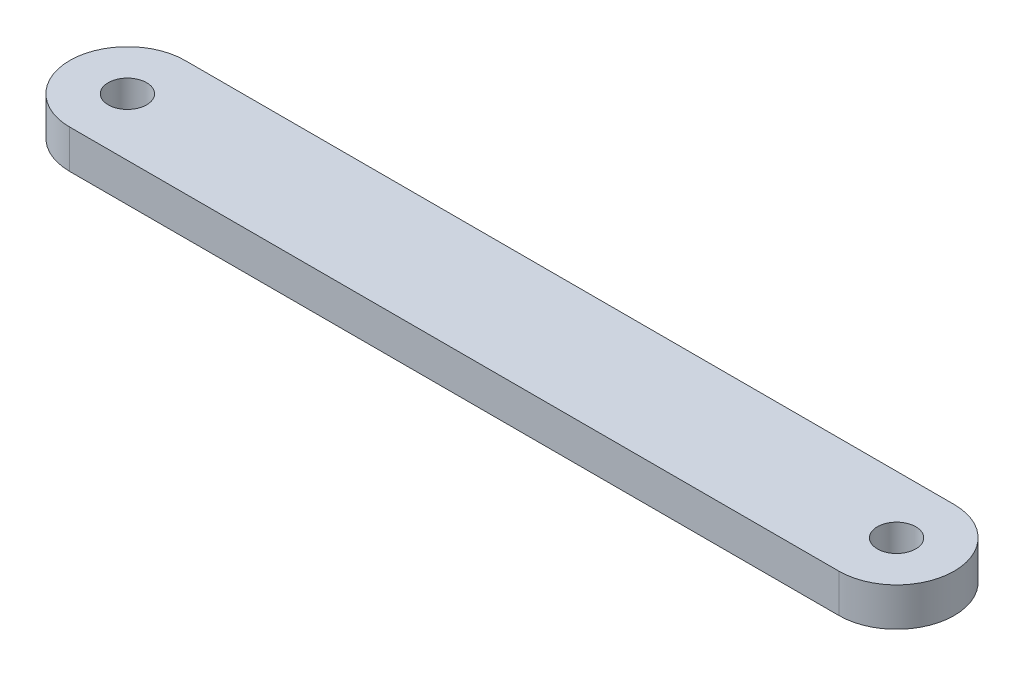
ISO-10303-21;
HEADER;
FILE_DESCRIPTION(('STEP AP214'),'2;1');
FILE_NAME('part.step','',(''),(''),'','','');
FILE_SCHEMA(('AUTOMOTIVE_DESIGN { 1 0 10303 214 1 1 1 1 }'));
ENDSEC;
DATA;
#1=APPLICATION_CONTEXT('core data for automotive mechanical design processes');
#2=APPLICATION_PROTOCOL_DEFINITION('international standard','automotive_design',2000,#1);
#3=PRODUCT_CONTEXT('',#1,'mechanical');
#4=PRODUCT('Part','Part','',(#3));
#5=PRODUCT_RELATED_PRODUCT_CATEGORY('part','',(#4));
#6=PRODUCT_DEFINITION_FORMATION('','',#4);
#7=PRODUCT_DEFINITION_CONTEXT('part definition',#1,'design');
#8=PRODUCT_DEFINITION('design','',#6,#7);
#9=PRODUCT_DEFINITION_SHAPE('','',#8);
#10=(LENGTH_UNIT() NAMED_UNIT(*) SI_UNIT(.MILLI.,.METRE.));
#11=(NAMED_UNIT(*) PLANE_ANGLE_UNIT() SI_UNIT($,.RADIAN.));
#12=(NAMED_UNIT(*) SI_UNIT($,.STERADIAN.) SOLID_ANGLE_UNIT());
#13=UNCERTAINTY_MEASURE_WITH_UNIT(LENGTH_MEASURE(1.E-05),#10,'distance_accuracy_value','');
#14=(GEOMETRIC_REPRESENTATION_CONTEXT(3) GLOBAL_UNCERTAINTY_ASSIGNED_CONTEXT((#13)) GLOBAL_UNIT_ASSIGNED_CONTEXT((#10,
#11,#12)) REPRESENTATION_CONTEXT('',''));
#15=CARTESIAN_POINT('',(0.,0.,0.));
#16=DIRECTION('',(0.,0.,1.));
#17=DIRECTION('',(1.,0.,0.));
#18=AXIS2_PLACEMENT_3D('',#15,#16,#17);
#19=CARTESIAN_POINT('',(50.,5.,0.));
#20=DIRECTION('',(0.,-1.,0.));
#21=DIRECTION('',(0.,0.,-1.));
#22=AXIS2_PLACEMENT_3D('',#19,#20,#21);
#23=PLANE('',#22);
#24=CARTESIAN_POINT('',(50.,5.,0.));
#25=DIRECTION('',(0.,1.,0.));
#26=DIRECTION('',(0.,0.,-1.));
#27=AXIS2_PLACEMENT_3D('',#24,#25,#26);
#28=CIRCLE('',#27,7.5);
#29=CARTESIAN_POINT('',(50.,5.,7.5));
#30=VERTEX_POINT('',#29);
#31=CARTESIAN_POINT('',(50.,5.,-7.5));
#32=VERTEX_POINT('',#31);
#33=EDGE_CURVE('E86',#30,#32,#28,.T.);
#34=ORIENTED_EDGE('',*,*,#33,.T.);
#35=DIRECTION('',(-1.,0.,0.));
#36=VECTOR('',#35,1.);
#37=CARTESIAN_POINT('',(-50.,5.,-7.5));
#38=LINE('',#37,#36);
#39=CARTESIAN_POINT('',(-50.,5.,-7.5));
#40=VERTEX_POINT('',#39);
#41=EDGE_CURVE('E81',#32,#40,#38,.T.);
#42=ORIENTED_EDGE('',*,*,#41,.T.);
#43=CARTESIAN_POINT('',(-50.,5.,0.));
#44=DIRECTION('',(0.,1.,0.));
#45=DIRECTION('',(0.,0.,1.));
#46=AXIS2_PLACEMENT_3D('',#43,#44,#45);
#47=CIRCLE('',#46,7.5);
#48=CARTESIAN_POINT('',(-50.,5.,7.5));
#49=VERTEX_POINT('',#48);
#50=EDGE_CURVE('E84',#40,#49,#47,.T.);
#51=ORIENTED_EDGE('',*,*,#50,.T.);
#52=DIRECTION('',(1.,0.,0.));
#53=VECTOR('',#52,1.);
#54=CARTESIAN_POINT('',(-50.,5.,7.5));
#55=LINE('',#54,#53);
#56=EDGE_CURVE('E51',#49,#30,#55,.T.);
#57=ORIENTED_EDGE('',*,*,#56,.T.);
#58=EDGE_LOOP('',(#34,#42,#51,#57));
#59=FACE_BOUND('',#58,.T.);
#60=CARTESIAN_POINT('',(-50.,5.,0.));
#61=DIRECTION('',(0.,1.,0.));
#62=DIRECTION('',(0.,0.,1.));
#63=AXIS2_PLACEMENT_3D('',#60,#61,#62);
#64=CIRCLE('',#63,2.5);
#65=CARTESIAN_POINT('',(-50.,5.,2.5));
#66=VERTEX_POINT('',#65);
#67=EDGE_CURVE('E101',#66,#66,#64,.T.);
#68=ORIENTED_EDGE('',*,*,#67,.F.);
#69=EDGE_LOOP('',(#68));
#70=FACE_BOUND('',#69,.T.);
#71=CARTESIAN_POINT('',(50.,5.,0.));
#72=DIRECTION('',(0.,1.,0.));
#73=DIRECTION('',(0.,0.,1.));
#74=AXIS2_PLACEMENT_3D('',#71,#72,#73);
#75=CIRCLE('',#74,2.5);
#76=CARTESIAN_POINT('',(50.,5.,2.5));
#77=VERTEX_POINT('',#76);
#78=EDGE_CURVE('E116',#77,#77,#75,.T.);
#79=ORIENTED_EDGE('',*,*,#78,.F.);
#80=EDGE_LOOP('',(#79));
#81=FACE_BOUND('',#80,.T.);
#82=ADVANCED_FACE('F34',(#59,#70,#81),#23,.F.);
#83=CARTESIAN_POINT('',(50.,0.,0.));
#84=DIRECTION('',(0.,-1.,0.));
#85=DIRECTION('',(0.,0.,-1.));
#86=AXIS2_PLACEMENT_3D('',#83,#84,#85);
#87=PLANE('',#86);
#88=CARTESIAN_POINT('',(-50.,0.,0.));
#89=DIRECTION('',(0.,1.,0.));
#90=DIRECTION('',(0.,0.,1.));
#91=AXIS2_PLACEMENT_3D('',#88,#89,#90);
#92=CIRCLE('',#91,2.5);
#93=CARTESIAN_POINT('',(-50.,0.,2.5));
#94=VERTEX_POINT('',#93);
#95=EDGE_CURVE('E113',#94,#94,#92,.T.);
#96=ORIENTED_EDGE('',*,*,#95,.T.);
#97=EDGE_LOOP('',(#96));
#98=FACE_BOUND('',#97,.T.);
#99=CARTESIAN_POINT('',(50.,0.,0.));
#100=DIRECTION('',(0.,1.,0.));
#101=DIRECTION('',(0.,0.,-1.));
#102=AXIS2_PLACEMENT_3D('',#99,#100,#101);
#103=CIRCLE('',#102,7.5);
#104=CARTESIAN_POINT('',(50.,0.,7.5));
#105=VERTEX_POINT('',#104);
#106=CARTESIAN_POINT('',(50.,0.,-7.5));
#107=VERTEX_POINT('',#106);
#108=EDGE_CURVE('E98',#105,#107,#103,.T.);
#109=ORIENTED_EDGE('',*,*,#108,.F.);
#110=DIRECTION('',(1.,0.,0.));
#111=VECTOR('',#110,1.);
#112=CARTESIAN_POINT('',(-50.,0.,7.5));
#113=LINE('',#112,#111);
#114=CARTESIAN_POINT('',(-50.,0.,7.5));
#115=VERTEX_POINT('',#114);
#116=EDGE_CURVE('E74',#115,#105,#113,.T.);
#117=ORIENTED_EDGE('',*,*,#116,.F.);
#118=CARTESIAN_POINT('',(-50.,0.,0.));
#119=DIRECTION('',(0.,1.,0.));
#120=DIRECTION('',(0.,0.,1.));
#121=AXIS2_PLACEMENT_3D('',#118,#119,#120);
#122=CIRCLE('',#121,7.5);
#123=CARTESIAN_POINT('',(-50.,0.,-7.5));
#124=VERTEX_POINT('',#123);
#125=EDGE_CURVE('E68',#124,#115,#122,.T.);
#126=ORIENTED_EDGE('',*,*,#125,.F.);
#127=DIRECTION('',(-1.,0.,0.));
#128=VECTOR('',#127,1.);
#129=CARTESIAN_POINT('',(-50.,0.,-7.5));
#130=LINE('',#129,#128);
#131=EDGE_CURVE('E90',#107,#124,#130,.T.);
#132=ORIENTED_EDGE('',*,*,#131,.F.);
#133=EDGE_LOOP('',(#109,#117,#126,#132));
#134=FACE_BOUND('',#133,.T.);
#135=CARTESIAN_POINT('',(50.,0.,0.));
#136=DIRECTION('',(0.,1.,0.));
#137=DIRECTION('',(0.,0.,1.));
#138=AXIS2_PLACEMENT_3D('',#135,#136,#137);
#139=CIRCLE('',#138,2.5);
#140=CARTESIAN_POINT('',(50.,0.,2.5));
#141=VERTEX_POINT('',#140);
#142=EDGE_CURVE('E119',#141,#141,#139,.T.);
#143=ORIENTED_EDGE('',*,*,#142,.T.);
#144=EDGE_LOOP('',(#143));
#145=FACE_BOUND('',#144,.T.);
#146=ADVANCED_FACE('F109',(#98,#134,#145),#87,.T.);
#147=CARTESIAN_POINT('',(50.,5.,0.));
#148=DIRECTION('',(0.,-1.,0.));
#149=DIRECTION('',(0.,0.,-1.));
#150=AXIS2_PLACEMENT_3D('',#147,#148,#149);
#151=CYLINDRICAL_SURFACE('',#150,7.5);
#152=ORIENTED_EDGE('',*,*,#108,.T.);
#153=DIRECTION('',(0.,-1.,0.));
#154=VECTOR('',#153,1.);
#155=CARTESIAN_POINT('',(50.,5.,-7.5));
#156=LINE('',#155,#154);
#157=EDGE_CURVE('E11',#32,#107,#156,.T.);
#158=ORIENTED_EDGE('',*,*,#157,.F.);
#159=ORIENTED_EDGE('',*,*,#33,.F.);
#160=DIRECTION('',(0.,-1.,0.));
#161=VECTOR('',#160,1.);
#162=CARTESIAN_POINT('',(50.,5.,7.5));
#163=LINE('',#162,#161);
#164=EDGE_CURVE('E94',#30,#105,#163,.T.);
#165=ORIENTED_EDGE('',*,*,#164,.T.);
#166=EDGE_LOOP('',(#152,#158,#159,#165));
#167=FACE_BOUND('',#166,.T.);
#168=ADVANCED_FACE('F36',(#167),#151,.T.);
#169=CARTESIAN_POINT('',(-50.,5.,-7.5));
#170=DIRECTION('',(0.,0.,1.));
#171=DIRECTION('',(1.,0.,0.));
#172=AXIS2_PLACEMENT_3D('',#169,#170,#171);
#173=PLANE('',#172);
#174=ORIENTED_EDGE('',*,*,#131,.T.);
#175=DIRECTION('',(0.,-1.,0.));
#176=VECTOR('',#175,1.);
#177=CARTESIAN_POINT('',(-50.,5.,-7.5));
#178=LINE('',#177,#176);
#179=EDGE_CURVE('E43',#40,#124,#178,.T.);
#180=ORIENTED_EDGE('',*,*,#179,.F.);
#181=ORIENTED_EDGE('',*,*,#41,.F.);
#182=ORIENTED_EDGE('',*,*,#157,.T.);
#183=EDGE_LOOP('',(#174,#180,#181,#182));
#184=FACE_BOUND('',#183,.T.);
#185=ADVANCED_FACE('F89',(#184),#173,.F.);
#186=CARTESIAN_POINT('',(-50.,5.,0.));
#187=DIRECTION('',(0.,-1.,0.));
#188=DIRECTION('',(0.,0.,-1.));
#189=AXIS2_PLACEMENT_3D('',#186,#187,#188);
#190=CYLINDRICAL_SURFACE('',#189,7.5);
#191=ORIENTED_EDGE('',*,*,#125,.T.);
#192=DIRECTION('',(0.,-1.,0.));
#193=VECTOR('',#192,1.);
#194=CARTESIAN_POINT('',(-50.,5.,7.5));
#195=LINE('',#194,#193);
#196=EDGE_CURVE('E91',#49,#115,#195,.T.);
#197=ORIENTED_EDGE('',*,*,#196,.F.);
#198=ORIENTED_EDGE('',*,*,#50,.F.);
#199=ORIENTED_EDGE('',*,*,#179,.T.);
#200=EDGE_LOOP('',(#191,#197,#198,#199));
#201=FACE_BOUND('',#200,.T.);
#202=ADVANCED_FACE('F92',(#201),#190,.T.);
#203=CARTESIAN_POINT('',(-50.,5.,7.5));
#204=DIRECTION('',(0.,0.,-1.));
#205=DIRECTION('',(-1.,0.,0.));
#206=AXIS2_PLACEMENT_3D('',#203,#204,#205);
#207=PLANE('',#206);
#208=ORIENTED_EDGE('',*,*,#116,.T.);
#209=ORIENTED_EDGE('',*,*,#164,.F.);
#210=ORIENTED_EDGE('',*,*,#56,.F.);
#211=ORIENTED_EDGE('',*,*,#196,.T.);
#212=EDGE_LOOP('',(#208,#209,#210,#211));
#213=FACE_BOUND('',#212,.T.);
#214=ADVANCED_FACE('F106',(#213),#207,.F.);
#215=CARTESIAN_POINT('',(-50.,5.,0.));
#216=DIRECTION('',(0.,-1.,0.));
#217=DIRECTION('',(0.,0.,-1.));
#218=AXIS2_PLACEMENT_3D('',#215,#216,#217);
#219=CYLINDRICAL_SURFACE('',#218,2.5);
#220=ORIENTED_EDGE('',*,*,#67,.T.);
#221=EDGE_LOOP('',(#220));
#222=FACE_BOUND('',#221,.T.);
#223=ORIENTED_EDGE('',*,*,#95,.F.);
#224=EDGE_LOOP('',(#223));
#225=FACE_BOUND('',#224,.T.);
#226=ADVANCED_FACE('F136',(#222,#225),#219,.F.);
#227=CARTESIAN_POINT('',(50.,5.,0.));
#228=DIRECTION('',(0.,-1.,0.));
#229=DIRECTION('',(0.,0.,-1.));
#230=AXIS2_PLACEMENT_3D('',#227,#228,#229);
#231=CYLINDRICAL_SURFACE('',#230,2.5);
#232=ORIENTED_EDGE('',*,*,#78,.T.);
#233=EDGE_LOOP('',(#232));
#234=FACE_BOUND('',#233,.T.);
#235=ORIENTED_EDGE('',*,*,#142,.F.);
#236=EDGE_LOOP('',(#235));
#237=FACE_BOUND('',#236,.T.);
#238=ADVANCED_FACE('F125',(#234,#237),#231,.F.);
#239=CLOSED_SHELL('',(#82,#146,#168,#185,#202,#214,#226,#238));
#240=MANIFOLD_SOLID_BREP('B2',#239);
#241=ADVANCED_BREP_SHAPE_REPRESENTATION('',(#18,#240),#14);
#242=SHAPE_DEFINITION_REPRESENTATION(#9,#241);
ENDSEC;
END-ISO-10303-21;
